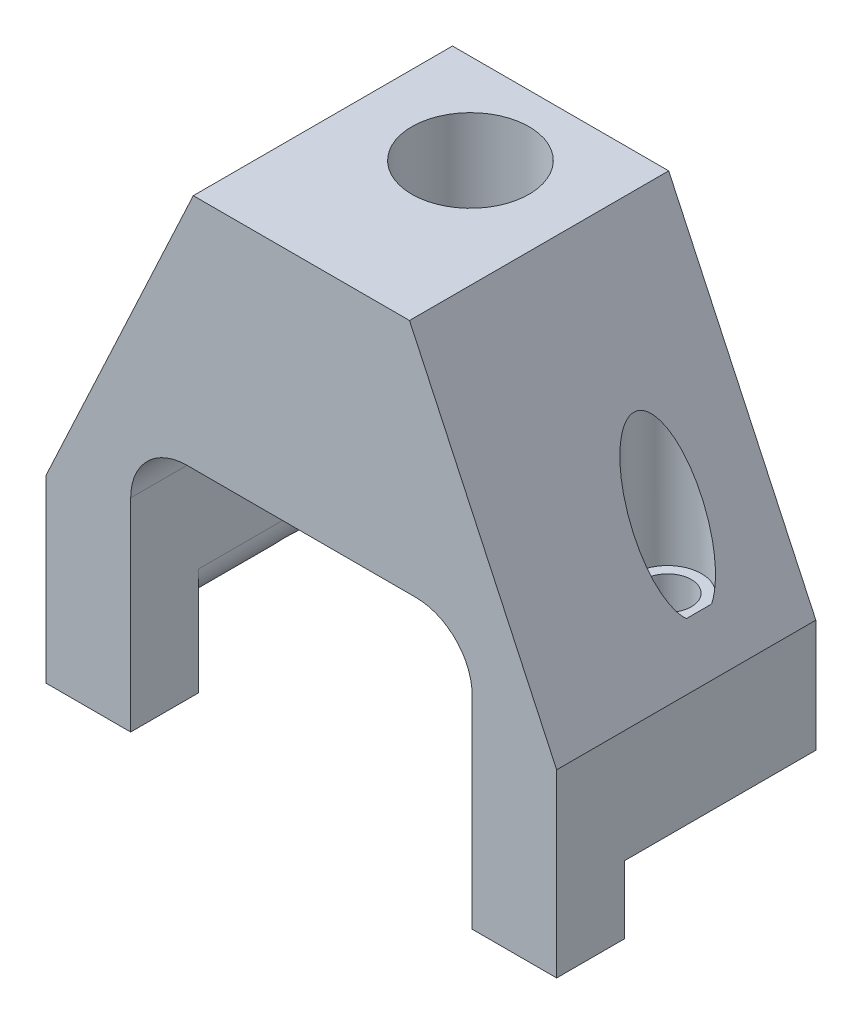
ISO-10303-21;
HEADER;
FILE_DESCRIPTION(('STEP AP214'),'2;1');
FILE_NAME('part.step','',(''),(''),'','','');
FILE_SCHEMA(('AUTOMOTIVE_DESIGN { 1 0 10303 214 1 1 1 1 }'));
ENDSEC;
DATA;
#1=APPLICATION_CONTEXT('core data for automotive mechanical design processes');
#2=APPLICATION_PROTOCOL_DEFINITION('international standard','automotive_design',2000,#1);
#3=PRODUCT_CONTEXT('',#1,'mechanical');
#4=PRODUCT('Part','Part','',(#3));
#5=PRODUCT_RELATED_PRODUCT_CATEGORY('part','',(#4));
#6=PRODUCT_DEFINITION_FORMATION('','',#4);
#7=PRODUCT_DEFINITION_CONTEXT('part definition',#1,'design');
#8=PRODUCT_DEFINITION('design','',#6,#7);
#9=PRODUCT_DEFINITION_SHAPE('','',#8);
#10=(LENGTH_UNIT() NAMED_UNIT(*) SI_UNIT(.MILLI.,.METRE.));
#11=(NAMED_UNIT(*) PLANE_ANGLE_UNIT() SI_UNIT($,.RADIAN.));
#12=(NAMED_UNIT(*) SI_UNIT($,.STERADIAN.) SOLID_ANGLE_UNIT());
#13=UNCERTAINTY_MEASURE_WITH_UNIT(LENGTH_MEASURE(1.E-05),#10,'distance_accuracy_value','');
#14=(GEOMETRIC_REPRESENTATION_CONTEXT(3) GLOBAL_UNCERTAINTY_ASSIGNED_CONTEXT((#13)) GLOBAL_UNIT_ASSIGNED_CONTEXT((#10,
#11,#12)) REPRESENTATION_CONTEXT('',''));
#15=CARTESIAN_POINT('',(0.,0.,0.));
#16=DIRECTION('',(0.,0.,1.));
#17=DIRECTION('',(1.,0.,0.));
#18=AXIS2_PLACEMENT_3D('',#15,#16,#17);
#19=CARTESIAN_POINT('',(-1.425,0.,-7.25));
#20=DIRECTION('',(0.,1.,0.));
#21=DIRECTION('',(0.,0.,1.));
#22=AXIS2_PLACEMENT_3D('',#19,#20,#21);
#23=CYLINDRICAL_SURFACE('',#22,1.05);
#24=CARTESIAN_POINT('',(-1.76,0.,-6.25487437978916));
#25=CARTESIAN_POINT('',(-1.81348962189329,2.61102334886398E-06,-6.27288473152848));
#26=CARTESIAN_POINT('',(-1.86559263597896,0.0024623517669066,-6.29525356328275));
#27=CARTESIAN_POINT('',(-1.96534175427919,0.0112975128803419,-6.34792986024633));
#28=CARTESIAN_POINT('',(-2.01297551859532,0.0176834270353038,-6.37825847525351));
#29=CARTESIAN_POINT('',(-2.10229584848474,0.0330151949282483,-6.44570797639228));
#30=CARTESIAN_POINT('',(-2.1440109044231,0.0419481155919322,-6.4827942139977));
#31=CARTESIAN_POINT('',(-2.22092413909098,0.0609647069351078,-6.56291151957827));
#32=CARTESIAN_POINT('',(-2.25612317763559,0.0710482255042731,-6.60594180190212));
#33=CARTESIAN_POINT('',(-2.32141240149125,0.0915683570019794,-6.70005909716368));
#34=CARTESIAN_POINT('',(-2.35101622033419,0.10198476467722,-6.75148939521628));
#35=CARTESIAN_POINT('',(-2.4012525956055,0.120756743189348,-6.85891892723447));
#36=CARTESIAN_POINT('',(-2.4218867956963,0.129112691479227,-6.91491732187108));
#37=CARTESIAN_POINT('',(-2.45325508817285,0.142196739695877,-7.02938415701767));
#38=CARTESIAN_POINT('',(-2.46409562573086,0.146963749733259,-7.08781863525544));
#39=CARTESIAN_POINT('',(-2.47574390826318,0.152096062550536,-7.20585461518337));
#40=CARTESIAN_POINT('',(-2.47655786576151,0.152464090959392,-7.2654553713071));
#41=CARTESIAN_POINT('',(-2.46846708656308,0.148886360764392,-7.37908458339458));
#42=CARTESIAN_POINT('',(-2.46032651275219,0.145279744991406,-7.43318069365827));
#43=CARTESIAN_POINT('',(-2.43586147118571,0.134888987593067,-7.53916953160773));
#44=CARTESIAN_POINT('',(-2.41953470328497,0.128103952935334,-7.59106163556735));
#45=CARTESIAN_POINT('',(-2.37881430468075,0.112227787713973,-7.69248001189552));
#46=CARTESIAN_POINT('',(-2.35425802675668,0.103091099984914,-7.74193344423324));
#47=CARTESIAN_POINT('',(-2.29781036844338,0.0839190788928453,-7.83628244380958));
#48=CARTESIAN_POINT('',(-2.26591547329135,0.0738833163371912,-7.88117581214886));
#49=CARTESIAN_POINT('',(-2.19258619143515,0.0535331583952056,-7.96891374236897));
#50=CARTESIAN_POINT('',(-2.15058993633705,0.0432615578278031,-8.01130113385955));
#51=CARTESIAN_POINT('',(-2.05971309749708,0.0250893112822279,-8.08856625345505));
#52=CARTESIAN_POINT('',(-2.01083357044889,0.0171883019616764,-8.12344513216386));
#53=CARTESIAN_POINT('',(-1.90862680199955,0.00555091721634934,-8.18383362192099));
#54=CARTESIAN_POINT('',(-1.85542617004798,0.00172381393630806,-8.20953847844388));
#55=CARTESIAN_POINT('',(-1.74536727079132,-0.000796482371158534,-8.25166248599735));
#56=CARTESIAN_POINT('',(-1.68851248682328,0.000505504629069471,-8.26809033833471));
#57=CARTESIAN_POINT('',(-1.5791592661224,0.00854534451876368,-8.28996337808716));
#58=CARTESIAN_POINT('',(-1.52680619789193,0.0147166139952498,-8.29635597911447));
#59=CARTESIAN_POINT('',(-1.42252511755504,0.0318503216446186,-8.3012934888184));
#60=CARTESIAN_POINT('',(-1.37059709277135,0.0428126163869079,-8.29983863241231));
#61=CARTESIAN_POINT('',(-1.26983808185206,0.0688495177351853,-8.2896789746184));
#62=CARTESIAN_POINT('',(-1.22096326493355,0.0838232902488106,-8.28114240759889));
#63=CARTESIAN_POINT('',(-1.12606701479174,0.117360348913741,-8.25773509289154));
#64=CARTESIAN_POINT('',(-1.08004630431857,0.135924539410489,-8.24286274822652));
#65=CARTESIAN_POINT('',(-0.986588277063192,0.178118764088859,-8.20556410900481));
#66=CARTESIAN_POINT('',(-0.939566711413043,0.202083007946433,-8.18247969877748));
#67=CARTESIAN_POINT('',(-0.85037308684014,0.252416754416633,-8.13032817169681));
#68=CARTESIAN_POINT('',(-0.808205261979927,0.278788321592054,-8.10125589218562));
#69=CARTESIAN_POINT('',(-0.721471288691963,0.337921454998297,-8.03179028183773));
#70=CARTESIAN_POINT('',(-0.677966692796402,0.370946444437754,-7.99029556550342));
#71=CARTESIAN_POINT('',(-0.598481915293997,0.436697172863734,-7.90036471673259));
#72=CARTESIAN_POINT('',(-0.56250485247785,0.469422782463211,-7.8519257211091));
#73=CARTESIAN_POINT('',(-0.505817738401247,0.52475550152822,-7.75974498592748));
#74=CARTESIAN_POINT('',(-0.483492666295168,0.547989261803892,-7.7173734830333));
#75=CARTESIAN_POINT('',(-0.444340307296854,0.590609865009204,-7.62836522065786));
#76=CARTESIAN_POINT('',(-0.427501584380942,0.610004676461515,-7.58173759613523));
#77=CARTESIAN_POINT('',(-0.403704562812848,0.638252966253018,-7.49673872161163));
#78=CARTESIAN_POINT('',(-0.395325538230213,0.648531314126953,-7.45924993648326));
#79=CARTESIAN_POINT('',(-0.382687014361997,0.664229498720204,-7.38260973687285));
#80=CARTESIAN_POINT('',(-0.378420452321128,0.669657663982522,-7.34346129387865));
#81=CARTESIAN_POINT('',(-0.374347523687869,0.674836199281019,-7.26432486926255));
#82=CARTESIAN_POINT('',(-0.374565392175598,0.674555718334309,-7.22433349333338));
#83=CARTESIAN_POINT('',(-0.379499102086931,0.668289998384486,-7.14507414805851));
#84=CARTESIAN_POINT('',(-0.384219435103838,0.662299062718725,-7.10580694101018));
#85=CARTESIAN_POINT('',(-0.399106469902521,0.643876620072614,-7.02147529572434));
#86=CARTESIAN_POINT('',(-0.410167048010434,0.630404121710729,-6.97680394144242));
#87=CARTESIAN_POINT('',(-0.437321800074862,0.5987261430276,-6.8907807377209));
#88=CARTESIAN_POINT('',(-0.45342898750939,0.580508447185569,-6.84943782161344));
#89=CARTESIAN_POINT('',(-0.498471975750445,0.532124828480548,-6.75187929963877));
#90=CARTESIAN_POINT('',(-0.529895494511306,0.500329937188679,-6.69762957213765));
#91=CARTESIAN_POINT('',(-0.600978220493032,0.434621584262082,-6.59630043713711));
#92=CARTESIAN_POINT('',(-0.640648772486078,0.400705249740797,-6.54923106335525));
#93=CARTESIAN_POINT('',(-0.729033988405314,0.332443782127592,-6.46125099582135));
#94=CARTESIAN_POINT('',(-0.777973253339873,0.29811377051761,-6.42055284122244));
#95=CARTESIAN_POINT('',(-0.883697924719227,0.232402322902233,-6.34800999368179));
#96=CARTESIAN_POINT('',(-0.940468830631174,0.201015613639489,-6.31614925884378));
#97=CARTESIAN_POINT('',(-1.0488353376261,0.149196919369778,-6.26828751723422));
#98=CARTESIAN_POINT('',(-1.09914126319489,0.127834619344683,-6.25037980549581));
#99=CARTESIAN_POINT('',(-1.20345051659415,0.0893912089929925,-6.22222180175219));
#100=CARTESIAN_POINT('',(-1.2574530636879,0.0723091981876164,-6.21196989823296));
#101=CARTESIAN_POINT('',(-1.36814852857221,0.0432155665857048,-6.20005369162368));
#102=CARTESIAN_POINT('',(-1.4248571558868,0.0312389762873841,-6.19844786649279));
#103=CARTESIAN_POINT('',(-1.53861984094079,0.0130334440029328,-6.20462031896517));
#104=CARTESIAN_POINT('',(-1.5956728022643,0.00679132759799091,-6.21237699167455));
#105=CARTESIAN_POINT('',(-1.67004436482333,0.00220364471645471,-6.22882087558492));
#106=CARTESIAN_POINT('',(-1.68821919658475,0.00137154408423591,-6.23335510900981));
#107=CARTESIAN_POINT('',(-1.72431364212935,0.000269348363575766,-6.24339087691236));
#108=CARTESIAN_POINT('',(-1.74223330982942,-8.67256885082325E-07,-6.24889220366061));
#109=CARTESIAN_POINT('',(-1.76,0.,-6.25487437978916));
#110=B_SPLINE_CURVE_WITH_KNOTS('',3,(#24,#25,#26,#27,#28,#29,#30,#31,#32,#33,#34,#35,#36,#37,
#38,#39,#40,#41,#42,#43,#44,#45,#46,#47,#48,#49,#50,#51,#52,#53,#54,#55,#56,#57,#58,#59,#60,#61,
#62,#63,#64,#65,#66,#67,#68,#69,#70,#71,#72,#73,#74,#75,#76,#77,#78,#79,#80,#81,#82,#83,#84,#85,
#86,#87,#88,#89,#90,#91,#92,#93,#94,#95,#96,#97,#98,#99,#100,#101,#102,#103,#104,#105,#106,#107,
#108,#109),.UNSPECIFIED.,.T.,.F.,(4,2,2,2,2,2,2,2,2,2,2,2,2,2,2,2,2,2,2,2,2,2,2,2,2,2,2,2,2,2,2,
2,2,2,2,2,2,2,2,2,2,2,4),(0.,0.169242462067032,0.33893924985737,0.507789252883586,
0.676616959556563,0.856515451324507,1.03638096318811,1.21426717895023,1.39204316988899,
1.55574768212662,1.71949821762328,1.88669734820386,2.0539767245656,2.23474589899906,
2.41548735262911,2.59211353234183,2.76857377032219,2.92707903961283,3.08557956400099,
3.24041906607325,3.3952976196409,3.56747245057144,3.73979635437426,3.94479818172765,
4.14988477752306,4.30912923875056,4.46803960697177,4.58688340321478,4.70552273117768,
4.82480338580345,4.94420315766563,5.08726248802434,5.23069379846801,5.44046816098526,
5.65053302549553,5.86655584302507,6.08218392558586,6.25402997656477,6.42583984450054,
6.59881030628016,6.77138238347065,6.82760868499096,6.88382292395584),.UNSPECIFIED.);
#111=CARTESIAN_POINT('',(-1.76000000000001,0.,-8.24512562021083));
#112=VERTEX_POINT('',#111);
#113=CARTESIAN_POINT('',(-1.76000000000001,0.,-6.25487437978917));
#114=VERTEX_POINT('',#113);
#115=EDGE_CURVE('E272',#112,#114,#110,.T.);
#116=ORIENTED_EDGE('',*,*,#115,.T.);
#117=CARTESIAN_POINT('',(-1.425,0.,-7.25));
#118=DIRECTION('',(0.,1.,0.));
#119=DIRECTION('',(0.,0.,1.));
#120=AXIS2_PLACEMENT_3D('',#117,#118,#119);
#121=CIRCLE('',#120,1.05);
#122=EDGE_CURVE('E279',#112,#114,#121,.T.);
#123=ORIENTED_EDGE('',*,*,#122,.F.);
#124=EDGE_LOOP('',(#116,#123));
#125=FACE_BOUND('',#124,.T.);
#126=CARTESIAN_POINT('',(-1.425,7.,-7.25));
#127=DIRECTION('',(0.,1.,0.));
#128=DIRECTION('',(0.,0.,1.));
#129=AXIS2_PLACEMENT_3D('',#126,#127,#128);
#130=CIRCLE('',#129,1.05);
#131=CARTESIAN_POINT('',(-1.425,7.,-6.2));
#132=VERTEX_POINT('',#131);
#133=EDGE_CURVE('E489',#132,#132,#130,.F.);
#134=ORIENTED_EDGE('',*,*,#133,.F.);
#135=EDGE_LOOP('',(#134));
#136=FACE_BOUND('',#135,.T.);
#137=ADVANCED_FACE('F37',(#125,#136),#23,.F.);
#138=CARTESIAN_POINT('',(16.575,0.,-7.25));
#139=DIRECTION('',(0.,1.,0.));
#140=DIRECTION('',(0.,0.,1.));
#141=AXIS2_PLACEMENT_3D('',#138,#139,#140);
#142=CYLINDRICAL_SURFACE('',#141,1.05);
#143=CARTESIAN_POINT('',(16.575,0.,-7.25));
#144=DIRECTION('',(0.,1.,0.));
#145=DIRECTION('',(0.,0.,-1.));
#146=AXIS2_PLACEMENT_3D('',#143,#144,#145);
#147=CIRCLE('',#146,1.05);
#148=CARTESIAN_POINT('',(16.91,0.,-6.25487437978917));
#149=VERTEX_POINT('',#148);
#150=CARTESIAN_POINT('',(16.91,0.,-8.24512562021084));
#151=VERTEX_POINT('',#150);
#152=EDGE_CURVE('E280',#149,#151,#147,.T.);
#153=ORIENTED_EDGE('',*,*,#152,.F.);
#154=CARTESIAN_POINT('',(16.91,0.,-8.24512562021084));
#155=CARTESIAN_POINT('',(16.8851467228825,-2.07338209205612E-06,-8.25349369548755));
#156=CARTESIAN_POINT('',(16.8599890543913,0.000527187622289443,-8.26092382034186));
#157=CARTESIAN_POINT('',(16.809237157305,0.00270337649948521,-8.27387448442084));
#158=CARTESIAN_POINT('',(16.7836429686697,0.00435020259798822,-8.27939519746252));
#159=CARTESIAN_POINT('',(16.7067218942919,0.0110266571492773,-8.29299789367969));
#160=CARTESIAN_POINT('',(16.6549971434232,0.0177911694995766,-8.29820715306217));
#161=CARTESIAN_POINT('',(16.5521914083919,0.0359627151727551,-8.30101400547651));
#162=CARTESIAN_POINT('',(16.5011105801913,0.0473708517523113,-8.29860978873773));
#163=CARTESIAN_POINT('',(16.4009277023467,0.0744316424810245,-8.28669953816542));
#164=CARTESIAN_POINT('',(16.3518270203332,0.0900871744088335,-8.27718868160981));
#165=CARTESIAN_POINT('',(16.2549097118677,0.125613217075239,-8.25132518340499));
#166=CARTESIAN_POINT('',(16.2072074517958,0.145618024038085,-8.23473286893586));
#167=CARTESIAN_POINT('',(16.1157860657046,0.188574135935288,-8.19556769806441));
#168=CARTESIAN_POINT('',(16.0720676990627,0.211526000613649,-8.17299370467426));
#169=CARTESIAN_POINT('',(15.9820215313844,0.263474322494537,-8.11838749060334));
#170=CARTESIAN_POINT('',(15.9364844893101,0.292839132581507,-8.08540415939093));
#171=CARTESIAN_POINT('',(15.8515732237323,0.352859113237276,-8.01306799558974));
#172=CARTESIAN_POINT('',(15.8122143569728,0.383517266144486,-7.97369977077085));
#173=CARTESIAN_POINT('',(15.7334873016256,0.449842390000071,-7.88141344505556));
#174=CARTESIAN_POINT('',(15.6953959120066,0.485416239889668,-7.82733204183194));
#175=CARTESIAN_POINT('',(15.6291933025756,0.551979249594034,-7.7108758471282));
#176=CARTESIAN_POINT('',(15.6010456914143,0.582984879603489,-7.64853246918193));
#177=CARTESIAN_POINT('',(15.5668602365775,0.622491887089185,-7.54597015394609));
#178=CARTESIAN_POINT('',(15.5565949766273,0.634805206033837,-7.50864278755525));
#179=CARTESIAN_POINT('',(15.5401439130102,0.65489236339644,-7.43194640281023));
#180=CARTESIAN_POINT('',(15.5339493588567,0.662675934916896,-7.39258196134819));
#181=CARTESIAN_POINT('',(15.5260713640225,0.672623978550902,-7.31232453108292));
#182=CARTESIAN_POINT('',(15.5244265947034,0.674740276281424,-7.27142141619677));
#183=CARTESIAN_POINT('',(15.5259307623837,0.672823388657132,-7.18983877610731));
#184=CARTESIAN_POINT('',(15.5290815799098,0.668787790916031,-7.14915934489734));
#185=CARTESIAN_POINT('',(15.5393564326359,0.655919915356144,-7.07314836766901));
#186=CARTESIAN_POINT('',(15.5460782169978,0.647575312901694,-7.03767403285433));
#187=CARTESIAN_POINT('',(15.5627983800758,0.627383507592868,-6.96854944187112));
#188=CARTESIAN_POINT('',(15.5727996617978,0.615533202408422,-6.93490083270058));
#189=CARTESIAN_POINT('',(15.6035443953904,0.580328835269054,-6.84729203040016));
#190=CARTESIAN_POINT('',(15.6269537592733,0.554654556838422,-6.79520388628351));
#191=CARTESIAN_POINT('',(15.6807806316697,0.499798534505156,-6.69679934906868));
#192=CARTESIAN_POINT('',(15.7112163221999,0.470607786408167,-6.65049841915669));
#193=CARTESIAN_POINT('',(15.779924528501,0.409919029440736,-6.56179384442781));
#194=CARTESIAN_POINT('',(15.818471317589,0.378375577123314,-6.51963381784406));
#195=CARTESIAN_POINT('',(15.9022092315252,0.316158470439176,-6.44184549187675));
#196=CARTESIAN_POINT('',(15.947394379606,0.285484062966088,-6.40621138112825));
#197=CARTESIAN_POINT('',(16.0426155322966,0.2276006400948,-6.34323823774064));
#198=CARTESIAN_POINT('',(16.0924502180571,0.20031217732905,-6.315670390356));
#199=CARTESIAN_POINT('',(16.197589158327,0.149574181339764,-6.26848313069515));
#200=CARTESIAN_POINT('',(16.2528914661955,0.126123289662623,-6.24886090212376));
#201=CARTESIAN_POINT('',(16.3683989707822,0.084270148157823,-6.21878420274054));
#202=CARTESIAN_POINT('',(16.4286434917828,0.0659147851638743,-6.20841304704448));
#203=CARTESIAN_POINT('',(16.5516057525218,0.0357202954593124,-6.19845897573834));
#204=CARTESIAN_POINT('',(16.6143196557192,0.0238714572104935,-6.19885993692585));
#205=CARTESIAN_POINT('',(16.716283871479,0.0102389705760018,-6.20879289658402));
#206=CARTESIAN_POINT('',(16.7556260004164,0.00635307218166209,-6.21488980348145));
#207=CARTESIAN_POINT('',(16.8335521408092,0.00122308012313423,-6.23154681328526));
#208=CARTESIAN_POINT('',(16.872135739302,-1.96119318302158E-05,-6.24210928058125));
#209=CARTESIAN_POINT('',(16.91,0.,-6.25487437978917));
#210=B_SPLINE_CURVE_WITH_KNOTS('',3,(#154,#155,#156,#157,#158,#159,#160,#161,#162,#163,#164,
#165,#166,#167,#168,#169,#170,#171,#172,#173,#174,#175,#176,#177,#178,#179,#180,#181,#182,#183,
#184,#185,#186,#187,#188,#189,#190,#191,#192,#193,#194,#195,#196,#197,#198,#199,#200,#201,#202,
#203,#204,#205,#206,#207,#208,#209),.UNSPECIFIED.,.F.,.F.,(4,2,2,2,2,2,2,2,2,2,2,2,2,2,2,2,2,2,
2,2,2,2,2,2,2,2,2,4),(0.,0.07862627216757,0.157245384966015,0.313674217086594,0.470140236105052,
0.626712532949678,0.789066454050641,0.951451257286256,1.1410525858809,1.33111797759552,
1.55543873102368,1.77892981703349,1.90040042583109,2.02160905684215,2.14384479307255,
2.26612847479861,2.37689264510318,2.48775512956188,2.67454429245169,2.86182233753438,
3.0569240930035,3.25185125535767,3.44054523418463,3.62917227246219,3.81948141694606,
4.00950573146482,4.12918645856764,4.24893063279221),.UNSPECIFIED.);
#211=EDGE_CURVE('E227',#151,#149,#210,.T.);
#212=ORIENTED_EDGE('',*,*,#211,.F.);
#213=EDGE_LOOP('',(#153,#212));
#214=FACE_BOUND('',#213,.T.);
#215=CARTESIAN_POINT('',(16.575,7.,-7.25));
#216=DIRECTION('',(0.,1.,0.));
#217=DIRECTION('',(0.,0.,1.));
#218=AXIS2_PLACEMENT_3D('',#215,#216,#217);
#219=CIRCLE('',#218,1.05);
#220=CARTESIAN_POINT('',(16.575,7.,-6.2));
#221=VERTEX_POINT('',#220);
#222=EDGE_CURVE('E492',#221,#221,#219,.F.);
#223=ORIENTED_EDGE('',*,*,#222,.F.);
#224=EDGE_LOOP('',(#223));
#225=FACE_BOUND('',#224,.T.);
#226=ADVANCED_FACE('F242',(#214,#225),#142,.F.);
#227=CARTESIAN_POINT('',(7.575,-3.,-7.5));
#228=DIRECTION('',(0.,1.,0.));
#229=DIRECTION('',(0.,0.,1.));
#230=AXIS2_PLACEMENT_3D('',#227,#228,#229);
#231=CYLINDRICAL_SURFACE('',#230,1.25);
#232=CARTESIAN_POINT('',(7.575,8.5,-7.5));
#233=DIRECTION('',(0.,-1.,0.));
#234=DIRECTION('',(0.,0.,-1.));
#235=AXIS2_PLACEMENT_3D('',#232,#233,#234);
#236=CIRCLE('',#235,1.25);
#237=CARTESIAN_POINT('',(7.575,8.5,-8.75));
#238=VERTEX_POINT('',#237);
#239=EDGE_CURVE('E202',#238,#238,#236,.T.);
#240=ORIENTED_EDGE('',*,*,#239,.T.);
#241=EDGE_LOOP('',(#240));
#242=FACE_BOUND('',#241,.T.);
#243=CARTESIAN_POINT('',(7.575,14.,-7.5));
#244=DIRECTION('',(0.,1.,0.));
#245=DIRECTION('',(0.,0.,1.));
#246=AXIS2_PLACEMENT_3D('',#243,#244,#245);
#247=CIRCLE('',#246,1.25);
#248=CARTESIAN_POINT('',(7.575,14.,-6.25));
#249=VERTEX_POINT('',#248);
#250=EDGE_CURVE('E199',#249,#249,#247,.F.);
#251=ORIENTED_EDGE('',*,*,#250,.F.);
#252=EDGE_LOOP('',(#251));
#253=FACE_BOUND('',#252,.T.);
#254=ADVANCED_FACE('F247',(#242,#253),#231,.F.);
#255=CARTESIAN_POINT('',(16.91,0.,-11.5));
#256=DIRECTION('',(0.,-1.,0.));
#257=DIRECTION('',(0.,0.,-1.));
#258=AXIS2_PLACEMENT_3D('',#255,#256,#257);
#259=PLANE('',#258);
#260=DIRECTION('',(0.,0.,1.));
#261=VECTOR('',#260,1.);
#262=CARTESIAN_POINT('',(18.9,0.,-11.5));
#263=LINE('',#262,#261);
#264=CARTESIAN_POINT('',(18.9,0.,-11.5));
#265=VERTEX_POINT('',#264);
#266=CARTESIAN_POINT('',(18.9,0.,-3.));
#267=VERTEX_POINT('',#266);
#268=EDGE_CURVE('E236',#265,#267,#263,.T.);
#269=ORIENTED_EDGE('',*,*,#268,.T.);
#270=DIRECTION('',(-1.,0.,0.));
#271=VECTOR('',#270,1.);
#272=CARTESIAN_POINT('',(16.91,0.,-3.));
#273=LINE('',#272,#271);
#274=CARTESIAN_POINT('',(16.91,0.,-3.));
#275=VERTEX_POINT('',#274);
#276=EDGE_CURVE('E373',#267,#275,#273,.T.);
#277=ORIENTED_EDGE('',*,*,#276,.T.);
#278=DIRECTION('',(0.,0.,1.));
#279=VECTOR('',#278,1.);
#280=CARTESIAN_POINT('',(16.91,0.,-11.5));
#281=LINE('',#280,#279);
#282=EDGE_CURVE('E358',#149,#275,#281,.T.);
#283=ORIENTED_EDGE('',*,*,#282,.F.);
#284=ORIENTED_EDGE('',*,*,#152,.T.);
#285=CARTESIAN_POINT('',(16.91,0.,-11.5));
#286=VERTEX_POINT('',#285);
#287=EDGE_CURVE('E359',#286,#151,#281,.T.);
#288=ORIENTED_EDGE('',*,*,#287,.F.);
#289=DIRECTION('',(1.,0.,0.));
#290=VECTOR('',#289,1.);
#291=CARTESIAN_POINT('',(16.91,0.,-11.5));
#292=LINE('',#291,#290);
#293=EDGE_CURVE('E292',#286,#265,#292,.T.);
#294=ORIENTED_EDGE('',*,*,#293,.T.);
#295=EDGE_LOOP('',(#269,#277,#283,#284,#288,#294));
#296=FACE_BOUND('',#295,.T.);
#297=ADVANCED_FACE('F372',(#296),#259,.T.);
#298=CARTESIAN_POINT('',(16.91,1.76,-11.5));
#299=DIRECTION('',(0.,0.,1.));
#300=DIRECTION('',(1.,0.,0.));
#301=AXIS2_PLACEMENT_3D('',#298,#299,#300);
#302=CYLINDRICAL_SURFACE('',#301,1.76);
#303=CARTESIAN_POINT('',(16.91,1.76,-3.));
#304=DIRECTION('',(0.,0.,1.));
#305=DIRECTION('',(1.,0.,0.));
#306=AXIS2_PLACEMENT_3D('',#303,#304,#305);
#307=CIRCLE('',#306,1.76);
#308=CARTESIAN_POINT('',(15.15,1.76,-3.));
#309=VERTEX_POINT('',#308);
#310=EDGE_CURVE('E368',#309,#275,#307,.T.);
#311=ORIENTED_EDGE('',*,*,#310,.F.);
#312=DIRECTION('',(0.,0.,1.));
#313=VECTOR('',#312,1.);
#314=CARTESIAN_POINT('',(15.15,1.76,-11.5));
#315=LINE('',#314,#313);
#316=CARTESIAN_POINT('',(15.15,1.76,-11.5));
#317=VERTEX_POINT('',#316);
#318=EDGE_CURVE('E356',#317,#309,#315,.T.);
#319=ORIENTED_EDGE('',*,*,#318,.F.);
#320=CARTESIAN_POINT('',(16.91,1.76,-11.5));
#321=DIRECTION('',(0.,0.,-1.));
#322=DIRECTION('',(-1.,0.,0.));
#323=AXIS2_PLACEMENT_3D('',#320,#321,#322);
#324=CIRCLE('',#323,1.76);
#325=EDGE_CURVE('E295',#286,#317,#324,.T.);
#326=ORIENTED_EDGE('',*,*,#325,.F.);
#327=ORIENTED_EDGE('',*,*,#287,.T.);
#328=ORIENTED_EDGE('',*,*,#211,.T.);
#329=ORIENTED_EDGE('',*,*,#282,.T.);
#330=EDGE_LOOP('',(#311,#319,#326,#327,#328,#329));
#331=FACE_BOUND('',#330,.T.);
#332=ADVANCED_FACE('F238',(#331),#302,.T.);
#333=CARTESIAN_POINT('',(-3.75,0.,-11.5));
#334=DIRECTION('',(1.,0.,0.));
#335=DIRECTION('',(0.,0.,-1.));
#336=AXIS2_PLACEMENT_3D('',#333,#334,#335);
#337=PLANE('',#336);
#338=DIRECTION('',(0.,1.,0.));
#339=VECTOR('',#338,1.);
#340=CARTESIAN_POINT('',(-3.75,0.,0.));
#341=LINE('',#340,#339);
#342=CARTESIAN_POINT('',(-3.75,-3.,0.));
#343=VERTEX_POINT('',#342);
#344=CARTESIAN_POINT('',(-3.75,4.99999999999989,0.));
#345=VERTEX_POINT('',#344);
#346=EDGE_CURVE('E278',#343,#345,#341,.T.);
#347=ORIENTED_EDGE('',*,*,#346,.T.);
#348=DIRECTION('',(0.,0.,-1.));
#349=VECTOR('',#348,1.);
#350=CARTESIAN_POINT('',(-3.75,4.99999999999989,-11.5));
#351=LINE('',#350,#349);
#352=CARTESIAN_POINT('',(-3.75,4.99999999999989,-11.5));
#353=VERTEX_POINT('',#352);
#354=EDGE_CURVE('E214',#345,#353,#351,.T.);
#355=ORIENTED_EDGE('',*,*,#354,.T.);
#356=DIRECTION('',(0.,1.,0.));
#357=VECTOR('',#356,1.);
#358=CARTESIAN_POINT('',(-3.75,0.,-11.5));
#359=LINE('',#358,#357);
#360=CARTESIAN_POINT('',(-3.75,0.,-11.5));
#361=VERTEX_POINT('',#360);
#362=EDGE_CURVE('E282',#361,#353,#359,.T.);
#363=ORIENTED_EDGE('',*,*,#362,.F.);
#364=DIRECTION('',(0.,0.,1.));
#365=VECTOR('',#364,1.);
#366=CARTESIAN_POINT('',(-3.75,0.,-11.5));
#367=LINE('',#366,#365);
#368=CARTESIAN_POINT('',(-3.75,0.,-3.));
#369=VERTEX_POINT('',#368);
#370=EDGE_CURVE('E317',#361,#369,#367,.T.);
#371=ORIENTED_EDGE('',*,*,#370,.T.);
#372=DIRECTION('',(0.,-1.,0.));
#373=VECTOR('',#372,1.);
#374=CARTESIAN_POINT('',(-3.75,11.5,-3.));
#375=LINE('',#374,#373);
#376=CARTESIAN_POINT('',(-3.75,-3.,-3.));
#377=VERTEX_POINT('',#376);
#378=EDGE_CURVE('E395',#369,#377,#375,.T.);
#379=ORIENTED_EDGE('',*,*,#378,.T.);
#380=DIRECTION('',(0.,0.,-1.));
#381=VECTOR('',#380,1.);
#382=CARTESIAN_POINT('',(-3.75,-3.,0.));
#383=LINE('',#382,#381);
#384=EDGE_CURVE('E390',#343,#377,#383,.T.);
#385=ORIENTED_EDGE('',*,*,#384,.F.);
#386=EDGE_LOOP('',(#347,#355,#363,#371,#379,#385));
#387=FACE_BOUND('',#386,.T.);
#388=ADVANCED_FACE('F398',(#387),#337,.F.);
#389=CARTESIAN_POINT('',(-3.75,19.,-11.5));
#390=DIRECTION('',(0.,-1.,0.));
#391=DIRECTION('',(0.,0.,-1.));
#392=AXIS2_PLACEMENT_3D('',#389,#390,#391);
#393=PLANE('',#392);
#394=CARTESIAN_POINT('',(7.575,19.,-7.5));
#395=DIRECTION('',(0.,1.,0.));
#396=DIRECTION('',(0.,0.,1.));
#397=AXIS2_PLACEMENT_3D('',#394,#395,#396);
#398=CIRCLE('',#397,2.6);
#399=CARTESIAN_POINT('',(7.575,19.,-4.9));
#400=VERTEX_POINT('',#399);
#401=EDGE_CURVE('E491',#400,#400,#398,.T.);
#402=ORIENTED_EDGE('',*,*,#401,.F.);
#403=EDGE_LOOP('',(#402));
#404=FACE_BOUND('',#403,.T.);
#405=DIRECTION('',(1.,0.,0.));
#406=VECTOR('',#405,1.);
#407=CARTESIAN_POINT('',(-3.75,19.,0.));
#408=LINE('',#407,#406);
#409=CARTESIAN_POINT('',(2.77830721416999,19.,0.));
#410=VERTEX_POINT('',#409);
#411=CARTESIAN_POINT('',(12.37169278583,19.,0.));
#412=VERTEX_POINT('',#411);
#413=EDGE_CURVE('E320',#410,#412,#408,.T.);
#414=ORIENTED_EDGE('',*,*,#413,.T.);
#415=DIRECTION('',(0.,0.,-1.));
#416=VECTOR('',#415,1.);
#417=CARTESIAN_POINT('',(12.37169278583,19.,-11.5));
#418=LINE('',#417,#416);
#419=CARTESIAN_POINT('',(12.37169278583,19.,-11.5));
#420=VERTEX_POINT('',#419);
#421=EDGE_CURVE('E205',#412,#420,#418,.T.);
#422=ORIENTED_EDGE('',*,*,#421,.T.);
#423=DIRECTION('',(1.,0.,0.));
#424=VECTOR('',#423,1.);
#425=CARTESIAN_POINT('',(-3.75,19.,-11.5));
#426=LINE('',#425,#424);
#427=CARTESIAN_POINT('',(2.77830721416999,19.,-11.5));
#428=VERTEX_POINT('',#427);
#429=EDGE_CURVE('E285',#428,#420,#426,.T.);
#430=ORIENTED_EDGE('',*,*,#429,.F.);
#431=DIRECTION('',(0.,0.,1.));
#432=VECTOR('',#431,1.);
#433=CARTESIAN_POINT('',(2.77830721416999,19.,-11.5));
#434=LINE('',#433,#432);
#435=EDGE_CURVE('E218',#428,#410,#434,.T.);
#436=ORIENTED_EDGE('',*,*,#435,.T.);
#437=EDGE_LOOP('',(#414,#422,#430,#436));
#438=FACE_BOUND('',#437,.T.);
#439=ADVANCED_FACE('F469',(#404,#438),#393,.F.);
#440=CARTESIAN_POINT('',(18.9,0.,-11.5));
#441=DIRECTION('',(1.,0.,0.));
#442=DIRECTION('',(0.,0.,-1.));
#443=AXIS2_PLACEMENT_3D('',#440,#441,#442);
#444=PLANE('',#443);
#445=DIRECTION('',(0.,1.,0.));
#446=VECTOR('',#445,1.);
#447=CARTESIAN_POINT('',(18.9,0.,-11.5));
#448=LINE('',#447,#446);
#449=CARTESIAN_POINT('',(18.9,4.9999999999999,-11.5));
#450=VERTEX_POINT('',#449);
#451=EDGE_CURVE('E289',#265,#450,#448,.T.);
#452=ORIENTED_EDGE('',*,*,#451,.T.);
#453=DIRECTION('',(0.,0.,1.));
#454=VECTOR('',#453,1.);
#455=CARTESIAN_POINT('',(18.9,4.9999999999999,0.));
#456=LINE('',#455,#454);
#457=CARTESIAN_POINT('',(18.9,4.9999999999999,0.));
#458=VERTEX_POINT('',#457);
#459=EDGE_CURVE('E209',#450,#458,#456,.T.);
#460=ORIENTED_EDGE('',*,*,#459,.T.);
#461=DIRECTION('',(0.,1.,0.));
#462=VECTOR('',#461,1.);
#463=CARTESIAN_POINT('',(18.9,0.,0.));
#464=LINE('',#463,#462);
#465=CARTESIAN_POINT('',(18.9,-3.,0.));
#466=VERTEX_POINT('',#465);
#467=EDGE_CURVE('E323',#466,#458,#464,.T.);
#468=ORIENTED_EDGE('',*,*,#467,.F.);
#469=DIRECTION('',(0.,0.,-1.));
#470=VECTOR('',#469,1.);
#471=CARTESIAN_POINT('',(18.9,-3.,0.));
#472=LINE('',#471,#470);
#473=CARTESIAN_POINT('',(18.9,-3.,-3.));
#474=VERTEX_POINT('',#473);
#475=EDGE_CURVE('E433',#466,#474,#472,.T.);
#476=ORIENTED_EDGE('',*,*,#475,.T.);
#477=DIRECTION('',(0.,-1.,0.));
#478=VECTOR('',#477,1.);
#479=CARTESIAN_POINT('',(18.9,11.5,-3.));
#480=LINE('',#479,#478);
#481=EDGE_CURVE('E377',#267,#474,#480,.T.);
#482=ORIENTED_EDGE('',*,*,#481,.F.);
#483=ORIENTED_EDGE('',*,*,#268,.F.);
#484=EDGE_LOOP('',(#452,#460,#468,#476,#482,#483));
#485=FACE_BOUND('',#484,.T.);
#486=ADVANCED_FACE('F447',(#485),#444,.T.);
#487=CARTESIAN_POINT('',(15.15,1.76,-11.5));
#488=DIRECTION('',(1.,0.,0.));
#489=DIRECTION('',(0.,1.,0.));
#490=AXIS2_PLACEMENT_3D('',#487,#488,#489);
#491=PLANE('',#490);
#492=DIRECTION('',(0.,1.,0.));
#493=VECTOR('',#492,1.);
#494=CARTESIAN_POINT('',(15.15,1.76,0.));
#495=LINE('',#494,#493);
#496=CARTESIAN_POINT('',(15.15,-3.,0.));
#497=VERTEX_POINT('',#496);
#498=CARTESIAN_POINT('',(15.15,6.,0.));
#499=VERTEX_POINT('',#498);
#500=EDGE_CURVE('E326',#497,#499,#495,.T.);
#501=ORIENTED_EDGE('',*,*,#500,.T.);
#502=DIRECTION('',(0.,0.,1.));
#503=VECTOR('',#502,1.);
#504=CARTESIAN_POINT('',(15.15,6.,-11.5));
#505=LINE('',#504,#503);
#506=CARTESIAN_POINT('',(15.15,6.,-11.5));
#507=VERTEX_POINT('',#506);
#508=EDGE_CURVE('E354',#507,#499,#505,.T.);
#509=ORIENTED_EDGE('',*,*,#508,.F.);
#510=DIRECTION('',(0.,1.,0.));
#511=VECTOR('',#510,1.);
#512=CARTESIAN_POINT('',(15.15,1.76,-11.5));
#513=LINE('',#512,#511);
#514=EDGE_CURVE('E297',#317,#507,#513,.T.);
#515=ORIENTED_EDGE('',*,*,#514,.F.);
#516=ORIENTED_EDGE('',*,*,#318,.T.);
#517=DIRECTION('',(0.,-1.,0.));
#518=VECTOR('',#517,1.);
#519=CARTESIAN_POINT('',(15.15,11.5,-3.));
#520=LINE('',#519,#518);
#521=CARTESIAN_POINT('',(15.15,-3.,-3.));
#522=VERTEX_POINT('',#521);
#523=EDGE_CURVE('E436',#309,#522,#520,.T.);
#524=ORIENTED_EDGE('',*,*,#523,.T.);
#525=DIRECTION('',(0.,0.,-1.));
#526=VECTOR('',#525,1.);
#527=CARTESIAN_POINT('',(15.15,-3.,0.));
#528=LINE('',#527,#526);
#529=EDGE_CURVE('E427',#497,#522,#528,.T.);
#530=ORIENTED_EDGE('',*,*,#529,.F.);
#531=EDGE_LOOP('',(#501,#509,#515,#516,#524,#530));
#532=FACE_BOUND('',#531,.T.);
#533=ADVANCED_FACE('F439',(#532),#491,.F.);
#534=CARTESIAN_POINT('',(12.65,6.,-11.5));
#535=DIRECTION('',(0.,0.,1.));
#536=DIRECTION('',(1.,0.,0.));
#537=AXIS2_PLACEMENT_3D('',#534,#535,#536);
#538=CYLINDRICAL_SURFACE('',#537,2.5);
#539=CARTESIAN_POINT('',(12.65,6.,0.));
#540=DIRECTION('',(0.,0.,-1.));
#541=DIRECTION('',(-1.,0.,0.));
#542=AXIS2_PLACEMENT_3D('',#539,#540,#541);
#543=CIRCLE('',#542,2.5);
#544=CARTESIAN_POINT('',(12.65,8.5,0.));
#545=VERTEX_POINT('',#544);
#546=EDGE_CURVE('E329',#545,#499,#543,.T.);
#547=ORIENTED_EDGE('',*,*,#546,.F.);
#548=DIRECTION('',(0.,0.,1.));
#549=VECTOR('',#548,1.);
#550=CARTESIAN_POINT('',(12.65,8.5,-11.5));
#551=LINE('',#550,#549);
#552=CARTESIAN_POINT('',(12.65,8.5,-11.5));
#553=VERTEX_POINT('',#552);
#554=EDGE_CURVE('E352',#553,#545,#551,.T.);
#555=ORIENTED_EDGE('',*,*,#554,.F.);
#556=CARTESIAN_POINT('',(12.65,6.,-11.5));
#557=DIRECTION('',(0.,0.,-1.));
#558=DIRECTION('',(-1.,0.,0.));
#559=AXIS2_PLACEMENT_3D('',#556,#557,#558);
#560=CIRCLE('',#559,2.5);
#561=EDGE_CURVE('E299',#553,#507,#560,.T.);
#562=ORIENTED_EDGE('',*,*,#561,.T.);
#563=ORIENTED_EDGE('',*,*,#508,.T.);
#564=EDGE_LOOP('',(#547,#555,#562,#563));
#565=FACE_BOUND('',#564,.T.);
#566=ADVANCED_FACE('F454',(#565),#538,.F.);
#567=CARTESIAN_POINT('',(2.5,8.5,-11.5));
#568=DIRECTION('',(0.,-1.,0.));
#569=DIRECTION('',(0.,0.,-1.));
#570=AXIS2_PLACEMENT_3D('',#567,#568,#569);
#571=PLANE('',#570);
#572=ORIENTED_EDGE('',*,*,#239,.F.);
#573=EDGE_LOOP('',(#572));
#574=FACE_BOUND('',#573,.T.);
#575=DIRECTION('',(1.,0.,0.));
#576=VECTOR('',#575,1.);
#577=CARTESIAN_POINT('',(2.5,8.5,0.));
#578=LINE('',#577,#576);
#579=CARTESIAN_POINT('',(2.5,8.5,0.));
#580=VERTEX_POINT('',#579);
#581=EDGE_CURVE('E332',#580,#545,#578,.T.);
#582=ORIENTED_EDGE('',*,*,#581,.F.);
#583=DIRECTION('',(0.,0.,1.));
#584=VECTOR('',#583,1.);
#585=CARTESIAN_POINT('',(2.5,8.5,-11.5));
#586=LINE('',#585,#584);
#587=CARTESIAN_POINT('',(2.5,8.5,-11.5));
#588=VERTEX_POINT('',#587);
#589=EDGE_CURVE('E350',#588,#580,#586,.T.);
#590=ORIENTED_EDGE('',*,*,#589,.F.);
#591=DIRECTION('',(1.,0.,0.));
#592=VECTOR('',#591,1.);
#593=CARTESIAN_POINT('',(2.5,8.5,-11.5));
#594=LINE('',#593,#592);
#595=EDGE_CURVE('E302',#588,#553,#594,.T.);
#596=ORIENTED_EDGE('',*,*,#595,.T.);
#597=ORIENTED_EDGE('',*,*,#554,.T.);
#598=EDGE_LOOP('',(#582,#590,#596,#597));
#599=FACE_BOUND('',#598,.T.);
#600=ADVANCED_FACE('F457',(#574,#599),#571,.T.);
#601=CARTESIAN_POINT('',(2.5,6.,-11.5));
#602=DIRECTION('',(0.,0.,1.));
#603=DIRECTION('',(1.,0.,0.));
#604=AXIS2_PLACEMENT_3D('',#601,#602,#603);
#605=CYLINDRICAL_SURFACE('',#604,2.5);
#606=CARTESIAN_POINT('',(2.5,6.,0.));
#607=DIRECTION('',(0.,0.,-1.));
#608=DIRECTION('',(-1.,0.,0.));
#609=AXIS2_PLACEMENT_3D('',#606,#607,#608);
#610=CIRCLE('',#609,2.5);
#611=CARTESIAN_POINT('',(0.,6.,0.));
#612=VERTEX_POINT('',#611);
#613=EDGE_CURVE('E335',#612,#580,#610,.T.);
#614=ORIENTED_EDGE('',*,*,#613,.F.);
#615=DIRECTION('',(0.,0.,1.));
#616=VECTOR('',#615,1.);
#617=CARTESIAN_POINT('',(0.,6.,-11.5));
#618=LINE('',#617,#616);
#619=CARTESIAN_POINT('',(0.,6.,-11.5));
#620=VERTEX_POINT('',#619);
#621=EDGE_CURVE('E348',#620,#612,#618,.T.);
#622=ORIENTED_EDGE('',*,*,#621,.F.);
#623=CARTESIAN_POINT('',(2.5,6.,-11.5));
#624=DIRECTION('',(0.,0.,-1.));
#625=DIRECTION('',(-1.,0.,0.));
#626=AXIS2_PLACEMENT_3D('',#623,#624,#625);
#627=CIRCLE('',#626,2.5);
#628=EDGE_CURVE('E305',#620,#588,#627,.T.);
#629=ORIENTED_EDGE('',*,*,#628,.T.);
#630=ORIENTED_EDGE('',*,*,#589,.T.);
#631=EDGE_LOOP('',(#614,#622,#629,#630));
#632=FACE_BOUND('',#631,.T.);
#633=ADVANCED_FACE('F459',(#632),#605,.F.);
#634=CARTESIAN_POINT('',(0.,1.76000000000001,-11.5));
#635=DIRECTION('',(1.,0.,0.));
#636=DIRECTION('',(0.,0.,-1.));
#637=AXIS2_PLACEMENT_3D('',#634,#635,#636);
#638=PLANE('',#637);
#639=ORIENTED_EDGE('',*,*,#621,.T.);
#640=DIRECTION('',(0.,1.,0.));
#641=VECTOR('',#640,1.);
#642=CARTESIAN_POINT('',(0.,1.76000000000001,0.));
#643=LINE('',#642,#641);
#644=CARTESIAN_POINT('',(0.,-3.,0.));
#645=VERTEX_POINT('',#644);
#646=EDGE_CURVE('E286',#645,#612,#643,.T.);
#647=ORIENTED_EDGE('',*,*,#646,.F.);
#648=DIRECTION('',(0.,0.,-1.));
#649=VECTOR('',#648,1.);
#650=CARTESIAN_POINT('',(0.,-3.,0.));
#651=LINE('',#650,#649);
#652=CARTESIAN_POINT('',(0.,-3.,-3.));
#653=VERTEX_POINT('',#652);
#654=EDGE_CURVE('E411',#645,#653,#651,.T.);
#655=ORIENTED_EDGE('',*,*,#654,.T.);
#656=DIRECTION('',(0.,-1.,0.));
#657=VECTOR('',#656,1.);
#658=CARTESIAN_POINT('',(0.,11.5,-3.));
#659=LINE('',#658,#657);
#660=CARTESIAN_POINT('',(0.,1.76000000000001,-3.));
#661=VERTEX_POINT('',#660);
#662=EDGE_CURVE('E224',#661,#653,#659,.T.);
#663=ORIENTED_EDGE('',*,*,#662,.F.);
#664=DIRECTION('',(0.,0.,1.));
#665=VECTOR('',#664,1.);
#666=CARTESIAN_POINT('',(0.,1.76000000000001,-11.5));
#667=LINE('',#666,#665);
#668=CARTESIAN_POINT('',(0.,1.76000000000001,-11.5));
#669=VERTEX_POINT('',#668);
#670=EDGE_CURVE('E346',#669,#661,#667,.T.);
#671=ORIENTED_EDGE('',*,*,#670,.F.);
#672=DIRECTION('',(0.,1.,0.));
#673=VECTOR('',#672,1.);
#674=CARTESIAN_POINT('',(0.,1.76000000000001,-11.5));
#675=LINE('',#674,#673);
#676=EDGE_CURVE('E308',#669,#620,#675,.T.);
#677=ORIENTED_EDGE('',*,*,#676,.T.);
#678=EDGE_LOOP('',(#639,#647,#655,#663,#671,#677));
#679=FACE_BOUND('',#678,.T.);
#680=ADVANCED_FACE('F268',(#679),#638,.T.);
#681=CARTESIAN_POINT('',(-1.76,1.76,-11.5));
#682=DIRECTION('',(0.,0.,1.));
#683=DIRECTION('',(1.,0.,0.));
#684=AXIS2_PLACEMENT_3D('',#681,#682,#683);
#685=CYLINDRICAL_SURFACE('',#684,1.76);
#686=CARTESIAN_POINT('',(-1.76,1.76,-3.));
#687=DIRECTION('',(0.,0.,-1.));
#688=DIRECTION('',(-1.,0.,0.));
#689=AXIS2_PLACEMENT_3D('',#686,#687,#688);
#690=CIRCLE('',#689,1.76);
#691=CARTESIAN_POINT('',(-1.76000000000001,0.,-3.));
#692=VERTEX_POINT('',#691);
#693=EDGE_CURVE('E386',#692,#661,#690,.F.);
#694=ORIENTED_EDGE('',*,*,#693,.F.);
#695=DIRECTION('',(0.,0.,1.));
#696=VECTOR('',#695,1.);
#697=CARTESIAN_POINT('',(-1.76000000000001,0.,-11.5));
#698=LINE('',#697,#696);
#699=EDGE_CURVE('E342',#114,#692,#698,.T.);
#700=ORIENTED_EDGE('',*,*,#699,.F.);
#701=ORIENTED_EDGE('',*,*,#115,.F.);
#702=CARTESIAN_POINT('',(-1.76000000000001,0.,-11.5));
#703=VERTEX_POINT('',#702);
#704=EDGE_CURVE('E343',#703,#112,#698,.T.);
#705=ORIENTED_EDGE('',*,*,#704,.F.);
#706=CARTESIAN_POINT('',(-1.76,1.76,-11.5));
#707=DIRECTION('',(0.,0.,1.));
#708=DIRECTION('',(1.,0.,0.));
#709=AXIS2_PLACEMENT_3D('',#706,#707,#708);
#710=CIRCLE('',#709,1.76);
#711=EDGE_CURVE('E311',#703,#669,#710,.T.);
#712=ORIENTED_EDGE('',*,*,#711,.T.);
#713=ORIENTED_EDGE('',*,*,#670,.T.);
#714=EDGE_LOOP('',(#694,#700,#701,#705,#712,#713));
#715=FACE_BOUND('',#714,.T.);
#716=ADVANCED_FACE('F263',(#715),#685,.T.);
#717=CARTESIAN_POINT('',(-3.75,0.,-11.5));
#718=DIRECTION('',(0.,-1.,0.));
#719=DIRECTION('',(0.,0.,-1.));
#720=AXIS2_PLACEMENT_3D('',#717,#718,#719);
#721=PLANE('',#720);
#722=DIRECTION('',(1.,0.,0.));
#723=VECTOR('',#722,1.);
#724=CARTESIAN_POINT('',(-3.75,0.,-3.));
#725=LINE('',#724,#723);
#726=EDGE_CURVE('E221',#369,#692,#725,.T.);
#727=ORIENTED_EDGE('',*,*,#726,.F.);
#728=ORIENTED_EDGE('',*,*,#370,.F.);
#729=DIRECTION('',(1.,0.,0.));
#730=VECTOR('',#729,1.);
#731=CARTESIAN_POINT('',(-3.75,0.,-11.5));
#732=LINE('',#731,#730);
#733=EDGE_CURVE('E314',#361,#703,#732,.T.);
#734=ORIENTED_EDGE('',*,*,#733,.T.);
#735=ORIENTED_EDGE('',*,*,#704,.T.);
#736=ORIENTED_EDGE('',*,*,#122,.T.);
#737=ORIENTED_EDGE('',*,*,#699,.T.);
#738=EDGE_LOOP('',(#727,#728,#734,#735,#736,#737));
#739=FACE_BOUND('',#738,.T.);
#740=ADVANCED_FACE('F255',(#739),#721,.T.);
#741=CARTESIAN_POINT('',(16.91,1.76,-11.5));
#742=DIRECTION('',(0.,0.,-1.));
#743=DIRECTION('',(-1.,0.,0.));
#744=AXIS2_PLACEMENT_3D('',#741,#742,#743);
#745=PLANE('',#744);
#746=ORIENTED_EDGE('',*,*,#429,.T.);
#747=DIRECTION('',(0.422618261740697,-0.906307787036651,0.));
#748=VECTOR('',#747,1.);
#749=CARTESIAN_POINT('',(19.7855656694908,3.10089829321116,-11.5));
#750=LINE('',#749,#748);
#751=EDGE_CURVE('E190',#420,#450,#750,.T.);
#752=ORIENTED_EDGE('',*,*,#751,.T.);
#753=ORIENTED_EDGE('',*,*,#451,.F.);
#754=ORIENTED_EDGE('',*,*,#293,.F.);
#755=ORIENTED_EDGE('',*,*,#325,.T.);
#756=ORIENTED_EDGE('',*,*,#514,.T.);
#757=ORIENTED_EDGE('',*,*,#561,.F.);
#758=ORIENTED_EDGE('',*,*,#595,.F.);
#759=ORIENTED_EDGE('',*,*,#628,.F.);
#760=ORIENTED_EDGE('',*,*,#676,.F.);
#761=ORIENTED_EDGE('',*,*,#711,.F.);
#762=ORIENTED_EDGE('',*,*,#733,.F.);
#763=ORIENTED_EDGE('',*,*,#362,.T.);
#764=DIRECTION('',(-0.422618261740697,-0.906307787036651,0.));
#765=VECTOR('',#764,1.);
#766=CARTESIAN_POINT('',(-1.30098800591469,10.2519231697268,-11.5));
#767=LINE('',#766,#765);
#768=EDGE_CURVE('E212',#353,#428,#767,.F.);
#769=ORIENTED_EDGE('',*,*,#768,.T.);
#770=EDGE_LOOP('',(#746,#752,#753,#754,#755,#756,#757,#758,#759,#760,#761,#762,#763,#769));
#771=FACE_BOUND('',#770,.T.);
#772=ADVANCED_FACE('F251',(#771),#745,.T.);
#773=CARTESIAN_POINT('',(16.91,1.76,0.));
#774=DIRECTION('',(0.,0.,-1.));
#775=DIRECTION('',(-1.,0.,0.));
#776=AXIS2_PLACEMENT_3D('',#773,#774,#775);
#777=PLANE('',#776);
#778=ORIENTED_EDGE('',*,*,#467,.T.);
#779=DIRECTION('',(-0.422618261740697,0.906307787036651,0.));
#780=VECTOR('',#779,1.);
#781=CARTESIAN_POINT('',(18.9,4.9999999999999,0.));
#782=LINE('',#781,#780);
#783=EDGE_CURVE('E207',#458,#412,#782,.T.);
#784=ORIENTED_EDGE('',*,*,#783,.T.);
#785=ORIENTED_EDGE('',*,*,#413,.F.);
#786=DIRECTION('',(0.422618261740697,0.906307787036651,0.));
#787=VECTOR('',#786,1.);
#788=CARTESIAN_POINT('',(2.77830721416999,19.,0.));
#789=LINE('',#788,#787);
#790=EDGE_CURVE('E216',#410,#345,#789,.F.);
#791=ORIENTED_EDGE('',*,*,#790,.T.);
#792=ORIENTED_EDGE('',*,*,#346,.F.);
#793=DIRECTION('',(1.,0.,0.));
#794=VECTOR('',#793,1.);
#795=CARTESIAN_POINT('',(-3.75,-3.,0.));
#796=LINE('',#795,#794);
#797=EDGE_CURVE('E414',#343,#645,#796,.T.);
#798=ORIENTED_EDGE('',*,*,#797,.T.);
#799=ORIENTED_EDGE('',*,*,#646,.T.);
#800=ORIENTED_EDGE('',*,*,#613,.T.);
#801=ORIENTED_EDGE('',*,*,#581,.T.);
#802=ORIENTED_EDGE('',*,*,#546,.T.);
#803=ORIENTED_EDGE('',*,*,#500,.F.);
#804=DIRECTION('',(-1.,0.,0.));
#805=VECTOR('',#804,1.);
#806=CARTESIAN_POINT('',(0.,-3.,0.));
#807=LINE('',#806,#805);
#808=EDGE_CURVE('E389',#466,#497,#807,.T.);
#809=ORIENTED_EDGE('',*,*,#808,.F.);
#810=EDGE_LOOP('',(#778,#784,#785,#791,#792,#798,#799,#800,#801,#802,#803,#809));
#811=FACE_BOUND('',#810,.T.);
#812=ADVANCED_FACE('F254',(#811),#777,.F.);
#813=CARTESIAN_POINT('',(0.,11.5,-3.));
#814=DIRECTION('',(0.,0.,1.));
#815=DIRECTION('',(1.,0.,0.));
#816=AXIS2_PLACEMENT_3D('',#813,#814,#815);
#817=PLANE('',#816);
#818=ORIENTED_EDGE('',*,*,#276,.F.);
#819=ORIENTED_EDGE('',*,*,#481,.T.);
#820=DIRECTION('',(-1.,0.,0.));
#821=VECTOR('',#820,1.);
#822=CARTESIAN_POINT('',(0.,-3.,-3.));
#823=LINE('',#822,#821);
#824=EDGE_CURVE('E430',#474,#522,#823,.T.);
#825=ORIENTED_EDGE('',*,*,#824,.T.);
#826=ORIENTED_EDGE('',*,*,#523,.F.);
#827=ORIENTED_EDGE('',*,*,#310,.T.);
#828=EDGE_LOOP('',(#818,#819,#825,#826,#827));
#829=FACE_BOUND('',#828,.T.);
#830=ADVANCED_FACE('F259',(#829),#817,.F.);
#831=CARTESIAN_POINT('',(0.,-3.,0.));
#832=DIRECTION('',(0.,-1.,0.));
#833=DIRECTION('',(0.,0.,-1.));
#834=AXIS2_PLACEMENT_3D('',#831,#832,#833);
#835=PLANE('',#834);
#836=ORIENTED_EDGE('',*,*,#808,.T.);
#837=ORIENTED_EDGE('',*,*,#529,.T.);
#838=ORIENTED_EDGE('',*,*,#824,.F.);
#839=ORIENTED_EDGE('',*,*,#475,.F.);
#840=EDGE_LOOP('',(#836,#837,#838,#839));
#841=FACE_BOUND('',#840,.T.);
#842=ADVANCED_FACE('F443',(#841),#835,.T.);
#843=CARTESIAN_POINT('',(-3.75,11.5,-3.));
#844=DIRECTION('',(0.,0.,-1.));
#845=DIRECTION('',(-1.,0.,0.));
#846=AXIS2_PLACEMENT_3D('',#843,#844,#845);
#847=PLANE('',#846);
#848=ORIENTED_EDGE('',*,*,#726,.T.);
#849=ORIENTED_EDGE('',*,*,#693,.T.);
#850=ORIENTED_EDGE('',*,*,#662,.T.);
#851=DIRECTION('',(1.,0.,0.));
#852=VECTOR('',#851,1.);
#853=CARTESIAN_POINT('',(-3.75,-3.,-3.));
#854=LINE('',#853,#852);
#855=EDGE_CURVE('E421',#377,#653,#854,.T.);
#856=ORIENTED_EDGE('',*,*,#855,.F.);
#857=ORIENTED_EDGE('',*,*,#378,.F.);
#858=EDGE_LOOP('',(#848,#849,#850,#856,#857));
#859=FACE_BOUND('',#858,.T.);
#860=ADVANCED_FACE('F393',(#859),#847,.T.);
#861=CARTESIAN_POINT('',(0.,-3.,0.));
#862=DIRECTION('',(0.,-1.,0.));
#863=DIRECTION('',(0.,0.,-1.));
#864=AXIS2_PLACEMENT_3D('',#861,#862,#863);
#865=PLANE('',#864);
#866=ORIENTED_EDGE('',*,*,#384,.T.);
#867=ORIENTED_EDGE('',*,*,#855,.T.);
#868=ORIENTED_EDGE('',*,*,#654,.F.);
#869=ORIENTED_EDGE('',*,*,#797,.F.);
#870=EDGE_LOOP('',(#866,#867,#868,#869));
#871=FACE_BOUND('',#870,.T.);
#872=ADVANCED_FACE('F462',(#871),#865,.T.);
#873=CARTESIAN_POINT('',(2.77830721416999,19.,-11.5));
#874=DIRECTION('',(0.906307787036651,-0.422618261740697,0.));
#875=DIRECTION('',(0.,0.,1.));
#876=AXIS2_PLACEMENT_3D('',#873,#874,#875);
#877=PLANE('',#876);
#878=CARTESIAN_POINT('',(-1.425,9.98597859018465,-7.25));
#879=DIRECTION('',(0.906307787036651,-0.422618261740697,0.));
#880=DIRECTION('',(0.422618261740697,0.906307787036651,0.));
#881=AXIS2_PLACEMENT_3D('',#878,#879,#880);
#882=ELLIPSE('',#881,3.54930237472877,1.5);
#883=CARTESIAN_POINT('',(-2.81738468368996,7.,-6.6920888129589));
#884=VERTEX_POINT('',#883);
#885=CARTESIAN_POINT('',(-2.81738468368996,7.,-7.8079111870411));
#886=VERTEX_POINT('',#885);
#887=EDGE_CURVE('E11',#884,#886,#882,.F.);
#888=ORIENTED_EDGE('',*,*,#887,.F.);
#889=DIRECTION('',(0.,0.,1.));
#890=VECTOR('',#889,1.);
#891=CARTESIAN_POINT('',(-2.81738468368996,7.,-11.5));
#892=LINE('',#891,#890);
#893=EDGE_CURVE('E46',#884,#886,#892,.F.);
#894=ORIENTED_EDGE('',*,*,#893,.T.);
#895=EDGE_LOOP('',(#888,#894));
#896=FACE_BOUND('',#895,.T.);
#897=ORIENTED_EDGE('',*,*,#768,.F.);
#898=ORIENTED_EDGE('',*,*,#354,.F.);
#899=ORIENTED_EDGE('',*,*,#790,.F.);
#900=ORIENTED_EDGE('',*,*,#435,.F.);
#901=EDGE_LOOP('',(#897,#898,#899,#900));
#902=FACE_BOUND('',#901,.T.);
#903=ADVANCED_FACE('F464',(#896,#902),#877,.F.);
#904=CARTESIAN_POINT('',(18.9,4.9999999999999,-11.5));
#905=DIRECTION('',(0.906307787036651,0.422618261740697,0.));
#906=DIRECTION('',(0.,0.,-1.));
#907=AXIS2_PLACEMENT_3D('',#904,#905,#906);
#908=PLANE('',#907);
#909=CARTESIAN_POINT('',(16.575,9.98597859018466,-7.25));
#910=DIRECTION('',(0.906307787036651,0.422618261740697,0.));
#911=DIRECTION('',(-0.422618261740697,0.906307787036651,0.));
#912=AXIS2_PLACEMENT_3D('',#909,#910,#911);
#913=ELLIPSE('',#912,3.54930237472877,1.5);
#914=CARTESIAN_POINT('',(17.96738468369,7.,-7.8079111870411));
#915=VERTEX_POINT('',#914);
#916=CARTESIAN_POINT('',(17.96738468369,7.,-6.69208881295891));
#917=VERTEX_POINT('',#916);
#918=EDGE_CURVE('E189',#915,#917,#913,.T.);
#919=ORIENTED_EDGE('',*,*,#918,.F.);
#920=DIRECTION('',(0.,0.,1.));
#921=VECTOR('',#920,1.);
#922=CARTESIAN_POINT('',(17.96738468369,7.,-11.5));
#923=LINE('',#922,#921);
#924=EDGE_CURVE('E184',#915,#917,#923,.T.);
#925=ORIENTED_EDGE('',*,*,#924,.T.);
#926=EDGE_LOOP('',(#919,#925));
#927=FACE_BOUND('',#926,.T.);
#928=ORIENTED_EDGE('',*,*,#751,.F.);
#929=ORIENTED_EDGE('',*,*,#421,.F.);
#930=ORIENTED_EDGE('',*,*,#783,.F.);
#931=ORIENTED_EDGE('',*,*,#459,.F.);
#932=EDGE_LOOP('',(#928,#929,#930,#931));
#933=FACE_BOUND('',#932,.T.);
#934=ADVANCED_FACE('F40',(#927,#933),#908,.T.);
#935=CARTESIAN_POINT('',(7.575,14.,-7.5));
#936=DIRECTION('',(0.,1.,0.));
#937=DIRECTION('',(0.,0.,1.));
#938=AXIS2_PLACEMENT_3D('',#935,#936,#937);
#939=PLANE('',#938);
#940=CARTESIAN_POINT('',(7.575,14.,-7.5));
#941=DIRECTION('',(0.,1.,0.));
#942=DIRECTION('',(0.,0.,1.));
#943=AXIS2_PLACEMENT_3D('',#940,#941,#942);
#944=CIRCLE('',#943,2.6);
#945=CARTESIAN_POINT('',(7.575,14.,-4.9));
#946=VERTEX_POINT('',#945);
#947=EDGE_CURVE('E203',#946,#946,#944,.T.);
#948=ORIENTED_EDGE('',*,*,#947,.T.);
#949=EDGE_LOOP('',(#948));
#950=FACE_BOUND('',#949,.T.);
#951=ORIENTED_EDGE('',*,*,#250,.T.);
#952=EDGE_LOOP('',(#951));
#953=FACE_BOUND('',#952,.T.);
#954=ADVANCED_FACE('F474',(#950,#953),#939,.T.);
#955=CARTESIAN_POINT('',(7.575,14.,-7.5));
#956=DIRECTION('',(0.,1.,0.));
#957=DIRECTION('',(0.,0.,1.));
#958=AXIS2_PLACEMENT_3D('',#955,#956,#957);
#959=CYLINDRICAL_SURFACE('',#958,2.6);
#960=ORIENTED_EDGE('',*,*,#947,.F.);
#961=EDGE_LOOP('',(#960));
#962=FACE_BOUND('',#961,.T.);
#963=ORIENTED_EDGE('',*,*,#401,.T.);
#964=EDGE_LOOP('',(#963));
#965=FACE_BOUND('',#964,.T.);
#966=ADVANCED_FACE('F479',(#962,#965),#959,.F.);
#967=CARTESIAN_POINT('',(16.575,7.,-7.25));
#968=DIRECTION('',(0.,1.,0.));
#969=DIRECTION('',(0.,0.,1.));
#970=AXIS2_PLACEMENT_3D('',#967,#968,#969);
#971=PLANE('',#970);
#972=CARTESIAN_POINT('',(16.575,7.,-7.25));
#973=DIRECTION('',(0.,1.,0.));
#974=DIRECTION('',(0.,0.,1.));
#975=AXIS2_PLACEMENT_3D('',#972,#973,#974);
#976=CIRCLE('',#975,1.5);
#977=EDGE_CURVE('E58',#915,#917,#976,.T.);
#978=ORIENTED_EDGE('',*,*,#977,.T.);
#979=ORIENTED_EDGE('',*,*,#924,.F.);
#980=EDGE_LOOP('',(#978,#979));
#981=FACE_BOUND('',#980,.T.);
#982=ORIENTED_EDGE('',*,*,#222,.T.);
#983=EDGE_LOOP('',(#982));
#984=FACE_BOUND('',#983,.T.);
#985=ADVANCED_FACE('F185',(#981,#984),#971,.T.);
#986=CARTESIAN_POINT('',(16.575,7.,-7.25));
#987=DIRECTION('',(0.,1.,0.));
#988=DIRECTION('',(0.,0.,1.));
#989=AXIS2_PLACEMENT_3D('',#986,#987,#988);
#990=CYLINDRICAL_SURFACE('',#989,1.5);
#991=ORIENTED_EDGE('',*,*,#918,.T.);
#992=ORIENTED_EDGE('',*,*,#977,.F.);
#993=EDGE_LOOP('',(#991,#992));
#994=FACE_BOUND('',#993,.T.);
#995=ADVANCED_FACE('F193',(#994),#990,.F.);
#996=CARTESIAN_POINT('',(-1.425,7.,-7.25));
#997=DIRECTION('',(0.,1.,0.));
#998=DIRECTION('',(0.,0.,1.));
#999=AXIS2_PLACEMENT_3D('',#996,#997,#998);
#1000=PLANE('',#999);
#1001=CARTESIAN_POINT('',(-1.425,7.,-7.25));
#1002=DIRECTION('',(0.,1.,0.));
#1003=DIRECTION('',(0.,0.,1.));
#1004=AXIS2_PLACEMENT_3D('',#1001,#1002,#1003);
#1005=CIRCLE('',#1004,1.5);
#1006=EDGE_CURVE('E52',#884,#886,#1005,.T.);
#1007=ORIENTED_EDGE('',*,*,#1006,.T.);
#1008=ORIENTED_EDGE('',*,*,#893,.F.);
#1009=EDGE_LOOP('',(#1007,#1008));
#1010=FACE_BOUND('',#1009,.T.);
#1011=ORIENTED_EDGE('',*,*,#133,.T.);
#1012=EDGE_LOOP('',(#1011));
#1013=FACE_BOUND('',#1012,.T.);
#1014=ADVANCED_FACE('F585',(#1010,#1013),#1000,.T.);
#1015=CARTESIAN_POINT('',(-1.425,7.,-7.25));
#1016=DIRECTION('',(0.,1.,0.));
#1017=DIRECTION('',(0.,0.,1.));
#1018=AXIS2_PLACEMENT_3D('',#1015,#1016,#1017);
#1019=CYLINDRICAL_SURFACE('',#1018,1.5);
#1020=ORIENTED_EDGE('',*,*,#887,.T.);
#1021=ORIENTED_EDGE('',*,*,#1006,.F.);
#1022=EDGE_LOOP('',(#1020,#1021));
#1023=FACE_BOUND('',#1022,.T.);
#1024=ADVANCED_FACE('F594',(#1023),#1019,.F.);
#1025=CLOSED_SHELL('',(#137,#226,#254,#297,#332,#388,#439,#486,#533,#566,#600,#633,#680,#716,
#740,#772,#812,#830,#842,#860,#872,#903,#934,#954,#966,#985,#995,#1014,#1024));
#1026=MANIFOLD_SOLID_BREP('B2',#1025);
#1027=ADVANCED_BREP_SHAPE_REPRESENTATION('',(#18,#1026),#14);
#1028=SHAPE_DEFINITION_REPRESENTATION(#9,#1027);
ENDSEC;
END-ISO-10303-21;
